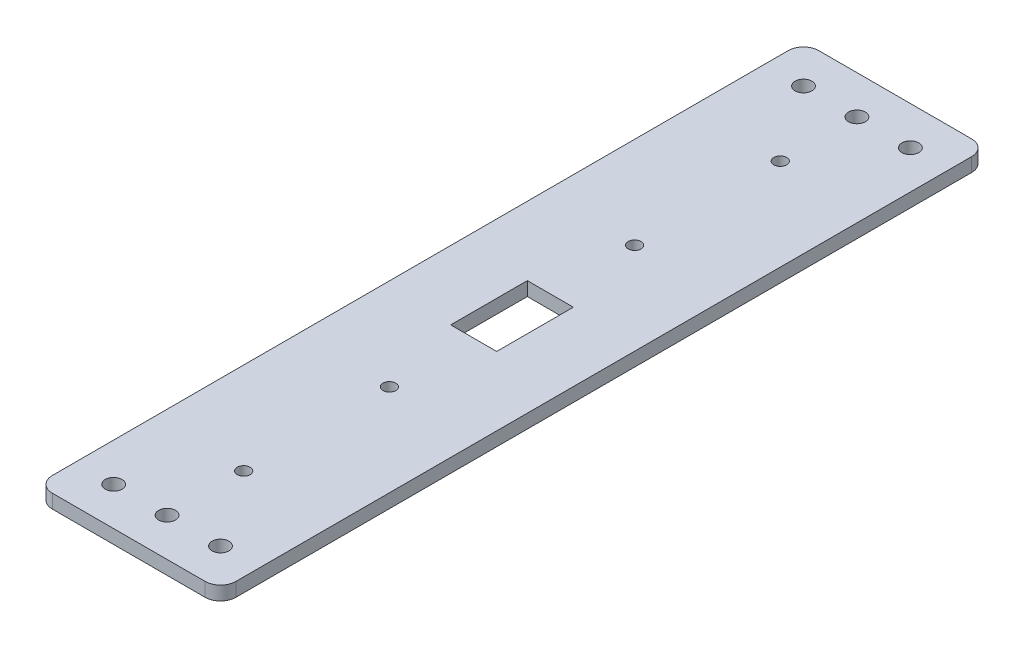
ISO-10303-21;
HEADER;
FILE_DESCRIPTION(('STEP AP214'),'2;1');
FILE_NAME('part.step','',(''),(''),'','','');
FILE_SCHEMA(('AUTOMOTIVE_DESIGN { 1 0 10303 214 1 1 1 1 }'));
ENDSEC;
DATA;
#1=APPLICATION_CONTEXT('core data for automotive mechanical design processes');
#2=APPLICATION_PROTOCOL_DEFINITION('international standard','automotive_design',2000,#1);
#3=PRODUCT_CONTEXT('',#1,'mechanical');
#4=PRODUCT('Part','Part','',(#3));
#5=PRODUCT_RELATED_PRODUCT_CATEGORY('part','',(#4));
#6=PRODUCT_DEFINITION_FORMATION('','',#4);
#7=PRODUCT_DEFINITION_CONTEXT('part definition',#1,'design');
#8=PRODUCT_DEFINITION('design','',#6,#7);
#9=PRODUCT_DEFINITION_SHAPE('','',#8);
#10=(LENGTH_UNIT() NAMED_UNIT(*) SI_UNIT(.MILLI.,.METRE.));
#11=(NAMED_UNIT(*) PLANE_ANGLE_UNIT() SI_UNIT($,.RADIAN.));
#12=(NAMED_UNIT(*) SI_UNIT($,.STERADIAN.) SOLID_ANGLE_UNIT());
#13=UNCERTAINTY_MEASURE_WITH_UNIT(LENGTH_MEASURE(1.E-05),#10,'distance_accuracy_value','');
#14=(GEOMETRIC_REPRESENTATION_CONTEXT(3) GLOBAL_UNCERTAINTY_ASSIGNED_CONTEXT((#13)) GLOBAL_UNIT_ASSIGNED_CONTEXT((#10,
#11,#12)) REPRESENTATION_CONTEXT('',''));
#15=CARTESIAN_POINT('',(0.,0.,0.));
#16=DIRECTION('',(0.,0.,1.));
#17=DIRECTION('',(1.,0.,0.));
#18=AXIS2_PLACEMENT_3D('',#15,#16,#17);
#19=CARTESIAN_POINT('',(-73.,-4.5,-120.));
#20=DIRECTION('',(0.,-1.,0.));
#21=DIRECTION('',(0.,0.,-1.));
#22=AXIS2_PLACEMENT_3D('',#19,#20,#21);
#23=PLANE('',#22);
#24=CARTESIAN_POINT('',(-48.07,-4.5,-40.));
#25=DIRECTION('',(0.,-1.,0.));
#26=DIRECTION('',(0.,0.,-1.));
#27=AXIS2_PLACEMENT_3D('',#24,#25,#26);
#28=CIRCLE('',#27,2.1);
#29=CARTESIAN_POINT('',(-48.07,-4.5,-42.1));
#30=VERTEX_POINT('',#29);
#31=EDGE_CURVE('E197',#30,#30,#28,.T.);
#32=ORIENTED_EDGE('',*,*,#31,.F.);
#33=EDGE_LOOP('',(#32));
#34=FACE_BOUND('',#33,.T.);
#35=CARTESIAN_POINT('',(-30.64,-4.5,112.5));
#36=DIRECTION('',(0.,-1.,0.));
#37=DIRECTION('',(0.,0.,-1.));
#38=AXIS2_PLACEMENT_3D('',#35,#36,#37);
#39=CIRCLE('',#38,2.75);
#40=CARTESIAN_POINT('',(-30.64,-4.5,109.75));
#41=VERTEX_POINT('',#40);
#42=EDGE_CURVE('E213',#41,#41,#39,.T.);
#43=ORIENTED_EDGE('',*,*,#42,.F.);
#44=EDGE_LOOP('',(#43));
#45=FACE_BOUND('',#44,.T.);
#46=CARTESIAN_POINT('',(-65.5,-4.5,-112.5));
#47=DIRECTION('',(0.,-1.,0.));
#48=DIRECTION('',(0.,0.,-1.));
#49=AXIS2_PLACEMENT_3D('',#46,#47,#48);
#50=CIRCLE('',#49,2.75000000000001);
#51=CARTESIAN_POINT('',(-65.5,-4.5,-115.25));
#52=VERTEX_POINT('',#51);
#53=EDGE_CURVE('E225',#52,#52,#50,.T.);
#54=ORIENTED_EDGE('',*,*,#53,.F.);
#55=EDGE_LOOP('',(#54));
#56=FACE_BOUND('',#55,.T.);
#57=CARTESIAN_POINT('',(-48.07,-4.5,87.5));
#58=DIRECTION('',(0.,-1.,0.));
#59=DIRECTION('',(0.,0.,-1.));
#60=AXIS2_PLACEMENT_3D('',#57,#58,#59);
#61=CIRCLE('',#60,2.1);
#62=CARTESIAN_POINT('',(-48.07,-4.5,85.4));
#63=VERTEX_POINT('',#62);
#64=EDGE_CURVE('E237',#63,#63,#61,.T.);
#65=ORIENTED_EDGE('',*,*,#64,.F.);
#66=EDGE_LOOP('',(#65));
#67=FACE_BOUND('',#66,.T.);
#68=CARTESIAN_POINT('',(-48.07,-4.5,-112.5));
#69=DIRECTION('',(0.,-1.,0.));
#70=DIRECTION('',(0.,0.,-1.));
#71=AXIS2_PLACEMENT_3D('',#68,#69,#70);
#72=CIRCLE('',#71,2.75);
#73=CARTESIAN_POINT('',(-48.07,-4.5,-115.25));
#74=VERTEX_POINT('',#73);
#75=EDGE_CURVE('E249',#74,#74,#72,.T.);
#76=ORIENTED_EDGE('',*,*,#75,.F.);
#77=EDGE_LOOP('',(#76));
#78=FACE_BOUND('',#77,.T.);
#79=CARTESIAN_POINT('',(-73.,-4.5,-120.));
#80=DIRECTION('',(0.,-1.,0.));
#81=DIRECTION('',(0.,0.,-1.));
#82=AXIS2_PLACEMENT_3D('',#79,#80,#81);
#83=CIRCLE('',#82,5.);
#84=CARTESIAN_POINT('',(-78.,-4.5,-120.));
#85=VERTEX_POINT('',#84);
#86=CARTESIAN_POINT('',(-73.,-4.5,-125.));
#87=VERTEX_POINT('',#86);
#88=EDGE_CURVE('E255',#85,#87,#83,.T.);
#89=ORIENTED_EDGE('',*,*,#88,.T.);
#90=DIRECTION('',(1.,0.,0.));
#91=VECTOR('',#90,1.);
#92=CARTESIAN_POINT('',(-73.,-4.5,-125.));
#93=LINE('',#92,#91);
#94=CARTESIAN_POINT('',(-23.14,-4.5,-125.));
#95=VERTEX_POINT('',#94);
#96=EDGE_CURVE('E258',#87,#95,#93,.T.);
#97=ORIENTED_EDGE('',*,*,#96,.T.);
#98=CARTESIAN_POINT('',(-23.14,-4.5,-120.));
#99=DIRECTION('',(0.,-1.,0.));
#100=DIRECTION('',(0.,0.,1.));
#101=AXIS2_PLACEMENT_3D('',#98,#99,#100);
#102=CIRCLE('',#101,5.);
#103=CARTESIAN_POINT('',(-18.14,-4.5,-120.));
#104=VERTEX_POINT('',#103);
#105=EDGE_CURVE('E261',#95,#104,#102,.T.);
#106=ORIENTED_EDGE('',*,*,#105,.T.);
#107=DIRECTION('',(0.,0.,1.));
#108=VECTOR('',#107,1.);
#109=CARTESIAN_POINT('',(-18.14,-4.5,120.));
#110=LINE('',#109,#108);
#111=CARTESIAN_POINT('',(-18.14,-4.5,120.));
#112=VERTEX_POINT('',#111);
#113=EDGE_CURVE('E263',#104,#112,#110,.T.);
#114=ORIENTED_EDGE('',*,*,#113,.T.);
#115=CARTESIAN_POINT('',(-23.14,-4.5,120.));
#116=DIRECTION('',(0.,-1.,0.));
#117=DIRECTION('',(0.,0.,-1.));
#118=AXIS2_PLACEMENT_3D('',#115,#116,#117);
#119=CIRCLE('',#118,5.00000000000001);
#120=CARTESIAN_POINT('',(-23.14,-4.5,125.));
#121=VERTEX_POINT('',#120);
#122=EDGE_CURVE('E265',#112,#121,#119,.T.);
#123=ORIENTED_EDGE('',*,*,#122,.T.);
#124=DIRECTION('',(-1.,0.,0.));
#125=VECTOR('',#124,1.);
#126=CARTESIAN_POINT('',(-23.14,-4.5,125.));
#127=LINE('',#126,#125);
#128=CARTESIAN_POINT('',(-73.,-4.5,125.));
#129=VERTEX_POINT('',#128);
#130=EDGE_CURVE('E267',#121,#129,#127,.T.);
#131=ORIENTED_EDGE('',*,*,#130,.T.);
#132=CARTESIAN_POINT('',(-73.,-4.5,120.));
#133=DIRECTION('',(0.,-1.,0.));
#134=DIRECTION('',(0.,0.,-1.));
#135=AXIS2_PLACEMENT_3D('',#132,#133,#134);
#136=CIRCLE('',#135,5.);
#137=CARTESIAN_POINT('',(-78.,-4.5,120.));
#138=VERTEX_POINT('',#137);
#139=EDGE_CURVE('E269',#129,#138,#136,.T.);
#140=ORIENTED_EDGE('',*,*,#139,.T.);
#141=DIRECTION('',(0.,0.,-1.));
#142=VECTOR('',#141,1.);
#143=CARTESIAN_POINT('',(-78.,-4.5,120.));
#144=LINE('',#143,#142);
#145=EDGE_CURVE('E271',#138,#85,#144,.T.);
#146=ORIENTED_EDGE('',*,*,#145,.T.);
#147=EDGE_LOOP('',(#89,#97,#106,#114,#123,#131,#140,#146));
#148=FACE_BOUND('',#147,.T.);
#149=CARTESIAN_POINT('',(-48.07,-4.5,-87.5));
#150=DIRECTION('',(0.,-1.,0.));
#151=DIRECTION('',(0.,0.,-1.));
#152=AXIS2_PLACEMENT_3D('',#149,#150,#151);
#153=CIRCLE('',#152,2.1);
#154=CARTESIAN_POINT('',(-48.07,-4.5,-89.6));
#155=VERTEX_POINT('',#154);
#156=EDGE_CURVE('E243',#155,#155,#153,.T.);
#157=ORIENTED_EDGE('',*,*,#156,.F.);
#158=EDGE_LOOP('',(#157));
#159=FACE_BOUND('',#158,.T.);
#160=CARTESIAN_POINT('',(-48.07,-4.5,112.5));
#161=DIRECTION('',(0.,-1.,0.));
#162=DIRECTION('',(0.,0.,-1.));
#163=AXIS2_PLACEMENT_3D('',#160,#161,#162);
#164=CIRCLE('',#163,2.75);
#165=CARTESIAN_POINT('',(-48.07,-4.5,109.75));
#166=VERTEX_POINT('',#165);
#167=EDGE_CURVE('E231',#166,#166,#164,.T.);
#168=ORIENTED_EDGE('',*,*,#167,.F.);
#169=EDGE_LOOP('',(#168));
#170=FACE_BOUND('',#169,.T.);
#171=CARTESIAN_POINT('',(-30.64,-4.5,-112.5));
#172=DIRECTION('',(0.,-1.,0.));
#173=DIRECTION('',(0.,0.,-1.));
#174=AXIS2_PLACEMENT_3D('',#171,#172,#173);
#175=CIRCLE('',#174,2.75);
#176=CARTESIAN_POINT('',(-30.64,-4.5,-115.25));
#177=VERTEX_POINT('',#176);
#178=EDGE_CURVE('E219',#177,#177,#175,.T.);
#179=ORIENTED_EDGE('',*,*,#178,.F.);
#180=EDGE_LOOP('',(#179));
#181=FACE_BOUND('',#180,.T.);
#182=CARTESIAN_POINT('',(-65.5,-4.5,112.5));
#183=DIRECTION('',(0.,-1.,0.));
#184=DIRECTION('',(0.,0.,-1.));
#185=AXIS2_PLACEMENT_3D('',#182,#183,#184);
#186=CIRCLE('',#185,2.75000000000001);
#187=CARTESIAN_POINT('',(-65.5,-4.5,109.75));
#188=VERTEX_POINT('',#187);
#189=EDGE_CURVE('E207',#188,#188,#186,.T.);
#190=ORIENTED_EDGE('',*,*,#189,.F.);
#191=EDGE_LOOP('',(#190));
#192=FACE_BOUND('',#191,.T.);
#193=DIRECTION('',(1.,0.,0.));
#194=VECTOR('',#193,1.);
#195=CARTESIAN_POINT('',(-55.57,-4.5,-12.5));
#196=LINE('',#195,#194);
#197=CARTESIAN_POINT('',(-55.57,-4.5,-12.5));
#198=VERTEX_POINT('',#197);
#199=CARTESIAN_POINT('',(-40.57,-4.5,-12.5));
#200=VERTEX_POINT('',#199);
#201=EDGE_CURVE('E176',#198,#200,#196,.T.);
#202=ORIENTED_EDGE('',*,*,#201,.F.);
#203=DIRECTION('',(0.,0.,-1.));
#204=VECTOR('',#203,1.);
#205=CARTESIAN_POINT('',(-55.57,-4.5,12.5));
#206=LINE('',#205,#204);
#207=CARTESIAN_POINT('',(-55.57,-4.5,12.5));
#208=VERTEX_POINT('',#207);
#209=EDGE_CURVE('E168',#208,#198,#206,.T.);
#210=ORIENTED_EDGE('',*,*,#209,.F.);
#211=DIRECTION('',(-1.,0.,0.));
#212=VECTOR('',#211,1.);
#213=CARTESIAN_POINT('',(-55.57,-4.5,12.5));
#214=LINE('',#213,#212);
#215=CARTESIAN_POINT('',(-40.57,-4.5,12.5));
#216=VERTEX_POINT('',#215);
#217=EDGE_CURVE('E191',#216,#208,#214,.T.);
#218=ORIENTED_EDGE('',*,*,#217,.F.);
#219=DIRECTION('',(0.,0.,1.));
#220=VECTOR('',#219,1.);
#221=CARTESIAN_POINT('',(-40.57,-4.5,12.5));
#222=LINE('',#221,#220);
#223=EDGE_CURVE('E189',#200,#216,#222,.T.);
#224=ORIENTED_EDGE('',*,*,#223,.F.);
#225=EDGE_LOOP('',(#202,#210,#218,#224));
#226=FACE_BOUND('',#225,.T.);
#227=CARTESIAN_POINT('',(-48.07,-4.5,40.));
#228=DIRECTION('',(0.,-1.,0.));
#229=DIRECTION('',(0.,0.,-1.));
#230=AXIS2_PLACEMENT_3D('',#227,#228,#229);
#231=CIRCLE('',#230,2.1);
#232=CARTESIAN_POINT('',(-48.07,-4.5,37.9));
#233=VERTEX_POINT('',#232);
#234=EDGE_CURVE('E438',#233,#233,#231,.T.);
#235=ORIENTED_EDGE('',*,*,#234,.F.);
#236=EDGE_LOOP('',(#235));
#237=FACE_BOUND('',#236,.T.);
#238=ADVANCED_FACE('F79',(#34,#45,#56,#67,#78,#148,#159,#170,#181,#192,#226,#237),#23,.T.);
#239=CARTESIAN_POINT('',(-73.,0.,-120.));
#240=DIRECTION('',(0.,-1.,0.));
#241=DIRECTION('',(0.,0.,-1.));
#242=AXIS2_PLACEMENT_3D('',#239,#240,#241);
#243=PLANE('',#242);
#244=CARTESIAN_POINT('',(-65.5,0.,112.5));
#245=DIRECTION('',(0.,-1.,0.));
#246=DIRECTION('',(0.,0.,-1.));
#247=AXIS2_PLACEMENT_3D('',#244,#245,#246);
#248=CIRCLE('',#247,2.75000000000001);
#249=CARTESIAN_POINT('',(-65.5,0.,109.75));
#250=VERTEX_POINT('',#249);
#251=EDGE_CURVE('E184',#250,#250,#248,.T.);
#252=ORIENTED_EDGE('',*,*,#251,.T.);
#253=EDGE_LOOP('',(#252));
#254=FACE_BOUND('',#253,.T.);
#255=CARTESIAN_POINT('',(-30.64,0.,112.5));
#256=DIRECTION('',(0.,-1.,0.));
#257=DIRECTION('',(0.,0.,-1.));
#258=AXIS2_PLACEMENT_3D('',#255,#256,#257);
#259=CIRCLE('',#258,2.75);
#260=CARTESIAN_POINT('',(-30.64,0.,109.75));
#261=VERTEX_POINT('',#260);
#262=EDGE_CURVE('E210',#261,#261,#259,.T.);
#263=ORIENTED_EDGE('',*,*,#262,.T.);
#264=EDGE_LOOP('',(#263));
#265=FACE_BOUND('',#264,.T.);
#266=CARTESIAN_POINT('',(-30.64,0.,-112.5));
#267=DIRECTION('',(0.,-1.,0.));
#268=DIRECTION('',(0.,0.,-1.));
#269=AXIS2_PLACEMENT_3D('',#266,#267,#268);
#270=CIRCLE('',#269,2.75);
#271=CARTESIAN_POINT('',(-30.64,0.,-115.25));
#272=VERTEX_POINT('',#271);
#273=EDGE_CURVE('E216',#272,#272,#270,.T.);
#274=ORIENTED_EDGE('',*,*,#273,.T.);
#275=EDGE_LOOP('',(#274));
#276=FACE_BOUND('',#275,.T.);
#277=CARTESIAN_POINT('',(-65.5,0.,-112.5));
#278=DIRECTION('',(0.,-1.,0.));
#279=DIRECTION('',(0.,0.,-1.));
#280=AXIS2_PLACEMENT_3D('',#277,#278,#279);
#281=CIRCLE('',#280,2.75000000000001);
#282=CARTESIAN_POINT('',(-65.5,0.,-115.25));
#283=VERTEX_POINT('',#282);
#284=EDGE_CURVE('E222',#283,#283,#281,.T.);
#285=ORIENTED_EDGE('',*,*,#284,.T.);
#286=EDGE_LOOP('',(#285));
#287=FACE_BOUND('',#286,.T.);
#288=CARTESIAN_POINT('',(-48.07,0.,112.5));
#289=DIRECTION('',(0.,-1.,0.));
#290=DIRECTION('',(0.,0.,-1.));
#291=AXIS2_PLACEMENT_3D('',#288,#289,#290);
#292=CIRCLE('',#291,2.75);
#293=CARTESIAN_POINT('',(-48.07,0.,109.75));
#294=VERTEX_POINT('',#293);
#295=EDGE_CURVE('E228',#294,#294,#292,.T.);
#296=ORIENTED_EDGE('',*,*,#295,.T.);
#297=EDGE_LOOP('',(#296));
#298=FACE_BOUND('',#297,.T.);
#299=CARTESIAN_POINT('',(-48.07,0.,87.5));
#300=DIRECTION('',(0.,-1.,0.));
#301=DIRECTION('',(0.,0.,-1.));
#302=AXIS2_PLACEMENT_3D('',#299,#300,#301);
#303=CIRCLE('',#302,2.1);
#304=CARTESIAN_POINT('',(-48.07,0.,85.4));
#305=VERTEX_POINT('',#304);
#306=EDGE_CURVE('E234',#305,#305,#303,.T.);
#307=ORIENTED_EDGE('',*,*,#306,.T.);
#308=EDGE_LOOP('',(#307));
#309=FACE_BOUND('',#308,.T.);
#310=CARTESIAN_POINT('',(-48.07,0.,-87.5));
#311=DIRECTION('',(0.,-1.,0.));
#312=DIRECTION('',(0.,0.,-1.));
#313=AXIS2_PLACEMENT_3D('',#310,#311,#312);
#314=CIRCLE('',#313,2.1);
#315=CARTESIAN_POINT('',(-48.07,0.,-89.6));
#316=VERTEX_POINT('',#315);
#317=EDGE_CURVE('E240',#316,#316,#314,.T.);
#318=ORIENTED_EDGE('',*,*,#317,.T.);
#319=EDGE_LOOP('',(#318));
#320=FACE_BOUND('',#319,.T.);
#321=CARTESIAN_POINT('',(-48.07,0.,-112.5));
#322=DIRECTION('',(0.,-1.,0.));
#323=DIRECTION('',(0.,0.,-1.));
#324=AXIS2_PLACEMENT_3D('',#321,#322,#323);
#325=CIRCLE('',#324,2.75);
#326=CARTESIAN_POINT('',(-48.07,0.,-115.25));
#327=VERTEX_POINT('',#326);
#328=EDGE_CURVE('E246',#327,#327,#325,.T.);
#329=ORIENTED_EDGE('',*,*,#328,.T.);
#330=EDGE_LOOP('',(#329));
#331=FACE_BOUND('',#330,.T.);
#332=CARTESIAN_POINT('',(-73.,0.,-120.));
#333=DIRECTION('',(0.,-1.,0.));
#334=DIRECTION('',(0.,0.,-1.));
#335=AXIS2_PLACEMENT_3D('',#332,#333,#334);
#336=CIRCLE('',#335,5.);
#337=CARTESIAN_POINT('',(-78.,0.,-120.));
#338=VERTEX_POINT('',#337);
#339=CARTESIAN_POINT('',(-73.,0.,-125.));
#340=VERTEX_POINT('',#339);
#341=EDGE_CURVE('E252',#338,#340,#336,.T.);
#342=ORIENTED_EDGE('',*,*,#341,.F.);
#343=DIRECTION('',(0.,0.,-1.));
#344=VECTOR('',#343,1.);
#345=CARTESIAN_POINT('',(-78.,0.,120.));
#346=LINE('',#345,#344);
#347=CARTESIAN_POINT('',(-78.,0.,120.));
#348=VERTEX_POINT('',#347);
#349=EDGE_CURVE('E259',#348,#338,#346,.T.);
#350=ORIENTED_EDGE('',*,*,#349,.F.);
#351=CARTESIAN_POINT('',(-73.,0.,120.));
#352=DIRECTION('',(0.,-1.,0.));
#353=DIRECTION('',(0.,0.,-1.));
#354=AXIS2_PLACEMENT_3D('',#351,#352,#353);
#355=CIRCLE('',#354,5.);
#356=CARTESIAN_POINT('',(-73.,0.,125.));
#357=VERTEX_POINT('',#356);
#358=EDGE_CURVE('E286',#357,#348,#355,.T.);
#359=ORIENTED_EDGE('',*,*,#358,.F.);
#360=DIRECTION('',(-1.,0.,0.));
#361=VECTOR('',#360,1.);
#362=CARTESIAN_POINT('',(-23.14,0.,125.));
#363=LINE('',#362,#361);
#364=CARTESIAN_POINT('',(-23.14,0.,125.));
#365=VERTEX_POINT('',#364);
#366=EDGE_CURVE('E284',#365,#357,#363,.T.);
#367=ORIENTED_EDGE('',*,*,#366,.F.);
#368=CARTESIAN_POINT('',(-23.14,0.,120.));
#369=DIRECTION('',(0.,-1.,0.));
#370=DIRECTION('',(0.,0.,-1.));
#371=AXIS2_PLACEMENT_3D('',#368,#369,#370);
#372=CIRCLE('',#371,5.00000000000001);
#373=CARTESIAN_POINT('',(-18.14,0.,120.));
#374=VERTEX_POINT('',#373);
#375=EDGE_CURVE('E282',#374,#365,#372,.T.);
#376=ORIENTED_EDGE('',*,*,#375,.F.);
#377=DIRECTION('',(0.,0.,1.));
#378=VECTOR('',#377,1.);
#379=CARTESIAN_POINT('',(-18.14,0.,120.));
#380=LINE('',#379,#378);
#381=CARTESIAN_POINT('',(-18.14,0.,-120.));
#382=VERTEX_POINT('',#381);
#383=EDGE_CURVE('E280',#382,#374,#380,.T.);
#384=ORIENTED_EDGE('',*,*,#383,.F.);
#385=CARTESIAN_POINT('',(-23.14,0.,-120.));
#386=DIRECTION('',(0.,-1.,0.));
#387=DIRECTION('',(0.,0.,1.));
#388=AXIS2_PLACEMENT_3D('',#385,#386,#387);
#389=CIRCLE('',#388,5.);
#390=CARTESIAN_POINT('',(-23.14,0.,-125.));
#391=VERTEX_POINT('',#390);
#392=EDGE_CURVE('E278',#391,#382,#389,.T.);
#393=ORIENTED_EDGE('',*,*,#392,.F.);
#394=DIRECTION('',(1.,0.,0.));
#395=VECTOR('',#394,1.);
#396=CARTESIAN_POINT('',(-73.,0.,-125.));
#397=LINE('',#396,#395);
#398=EDGE_CURVE('E276',#340,#391,#397,.T.);
#399=ORIENTED_EDGE('',*,*,#398,.F.);
#400=EDGE_LOOP('',(#342,#350,#359,#367,#376,#384,#393,#399));
#401=FACE_BOUND('',#400,.T.);
#402=DIRECTION('',(0.,0.,-1.));
#403=VECTOR('',#402,1.);
#404=CARTESIAN_POINT('',(-55.57,0.,12.5));
#405=LINE('',#404,#403);
#406=CARTESIAN_POINT('',(-55.57,0.,12.5));
#407=VERTEX_POINT('',#406);
#408=CARTESIAN_POINT('',(-55.57,0.,-12.5));
#409=VERTEX_POINT('',#408);
#410=EDGE_CURVE('E102',#407,#409,#405,.T.);
#411=ORIENTED_EDGE('',*,*,#410,.T.);
#412=DIRECTION('',(1.,0.,0.));
#413=VECTOR('',#412,1.);
#414=CARTESIAN_POINT('',(-55.57,0.,-12.5));
#415=LINE('',#414,#413);
#416=CARTESIAN_POINT('',(-40.57,0.,-12.5));
#417=VERTEX_POINT('',#416);
#418=EDGE_CURVE('E183',#409,#417,#415,.T.);
#419=ORIENTED_EDGE('',*,*,#418,.T.);
#420=DIRECTION('',(0.,0.,1.));
#421=VECTOR('',#420,1.);
#422=CARTESIAN_POINT('',(-40.57,0.,12.5));
#423=LINE('',#422,#421);
#424=CARTESIAN_POINT('',(-40.57,0.,12.5));
#425=VERTEX_POINT('',#424);
#426=EDGE_CURVE('E199',#417,#425,#423,.T.);
#427=ORIENTED_EDGE('',*,*,#426,.T.);
#428=DIRECTION('',(-1.,0.,0.));
#429=VECTOR('',#428,1.);
#430=CARTESIAN_POINT('',(-55.57,0.,12.5));
#431=LINE('',#430,#429);
#432=EDGE_CURVE('E177',#425,#407,#431,.T.);
#433=ORIENTED_EDGE('',*,*,#432,.T.);
#434=EDGE_LOOP('',(#411,#419,#427,#433));
#435=FACE_BOUND('',#434,.T.);
#436=CARTESIAN_POINT('',(-48.07,0.,-40.));
#437=DIRECTION('',(0.,-1.,0.));
#438=DIRECTION('',(0.,0.,-1.));
#439=AXIS2_PLACEMENT_3D('',#436,#437,#438);
#440=CIRCLE('',#439,2.1);
#441=CARTESIAN_POINT('',(-48.07,0.,-42.1));
#442=VERTEX_POINT('',#441);
#443=EDGE_CURVE('E444',#442,#442,#440,.T.);
#444=ORIENTED_EDGE('',*,*,#443,.T.);
#445=EDGE_LOOP('',(#444));
#446=FACE_BOUND('',#445,.T.);
#447=CARTESIAN_POINT('',(-48.07,0.,40.));
#448=DIRECTION('',(0.,-1.,0.));
#449=DIRECTION('',(0.,0.,-1.));
#450=AXIS2_PLACEMENT_3D('',#447,#448,#449);
#451=CIRCLE('',#450,2.1);
#452=CARTESIAN_POINT('',(-48.07,0.,37.9));
#453=VERTEX_POINT('',#452);
#454=EDGE_CURVE('E441',#453,#453,#451,.T.);
#455=ORIENTED_EDGE('',*,*,#454,.T.);
#456=EDGE_LOOP('',(#455));
#457=FACE_BOUND('',#456,.T.);
#458=ADVANCED_FACE('F316',(#254,#265,#276,#287,#298,#309,#320,#331,#401,#435,#446,#457),#243,.F.);
#459=CARTESIAN_POINT('',(-73.,-4.5,-120.));
#460=DIRECTION('',(0.,1.,0.));
#461=DIRECTION('',(0.,0.,1.));
#462=AXIS2_PLACEMENT_3D('',#459,#460,#461);
#463=CYLINDRICAL_SURFACE('',#462,5.);
#464=ORIENTED_EDGE('',*,*,#341,.T.);
#465=DIRECTION('',(0.,1.,0.));
#466=VECTOR('',#465,1.);
#467=CARTESIAN_POINT('',(-73.,-4.5,-125.));
#468=LINE('',#467,#466);
#469=EDGE_CURVE('E12',#87,#340,#468,.T.);
#470=ORIENTED_EDGE('',*,*,#469,.F.);
#471=ORIENTED_EDGE('',*,*,#88,.F.);
#472=DIRECTION('',(0.,1.,0.));
#473=VECTOR('',#472,1.);
#474=CARTESIAN_POINT('',(-78.,-4.5,-120.));
#475=LINE('',#474,#473);
#476=EDGE_CURVE('E273',#85,#338,#475,.T.);
#477=ORIENTED_EDGE('',*,*,#476,.T.);
#478=EDGE_LOOP('',(#464,#470,#471,#477));
#479=FACE_BOUND('',#478,.T.);
#480=ADVANCED_FACE('F81',(#479),#463,.T.);
#481=CARTESIAN_POINT('',(-73.,-4.5,-125.));
#482=DIRECTION('',(0.,0.,1.));
#483=DIRECTION('',(1.,0.,0.));
#484=AXIS2_PLACEMENT_3D('',#481,#482,#483);
#485=PLANE('',#484);
#486=ORIENTED_EDGE('',*,*,#398,.T.);
#487=DIRECTION('',(0.,1.,0.));
#488=VECTOR('',#487,1.);
#489=CARTESIAN_POINT('',(-23.14,-4.5,-125.));
#490=LINE('',#489,#488);
#491=EDGE_CURVE('E87',#95,#391,#490,.T.);
#492=ORIENTED_EDGE('',*,*,#491,.F.);
#493=ORIENTED_EDGE('',*,*,#96,.F.);
#494=ORIENTED_EDGE('',*,*,#469,.T.);
#495=EDGE_LOOP('',(#486,#492,#493,#494));
#496=FACE_BOUND('',#495,.T.);
#497=ADVANCED_FACE('F334',(#496),#485,.F.);
#498=CARTESIAN_POINT('',(-23.14,-4.5,-120.));
#499=DIRECTION('',(0.,1.,0.));
#500=DIRECTION('',(0.,0.,1.));
#501=AXIS2_PLACEMENT_3D('',#498,#499,#500);
#502=CYLINDRICAL_SURFACE('',#501,5.);
#503=ORIENTED_EDGE('',*,*,#392,.T.);
#504=DIRECTION('',(0.,1.,0.));
#505=VECTOR('',#504,1.);
#506=CARTESIAN_POINT('',(-18.14,-4.5,-120.));
#507=LINE('',#506,#505);
#508=EDGE_CURVE('E303',#104,#382,#507,.T.);
#509=ORIENTED_EDGE('',*,*,#508,.F.);
#510=ORIENTED_EDGE('',*,*,#105,.F.);
#511=ORIENTED_EDGE('',*,*,#491,.T.);
#512=EDGE_LOOP('',(#503,#509,#510,#511));
#513=FACE_BOUND('',#512,.T.);
#514=ADVANCED_FACE('F310',(#513),#502,.T.);
#515=CARTESIAN_POINT('',(-18.14,-4.5,120.));
#516=DIRECTION('',(-1.,0.,0.));
#517=DIRECTION('',(0.,0.,1.));
#518=AXIS2_PLACEMENT_3D('',#515,#516,#517);
#519=PLANE('',#518);
#520=ORIENTED_EDGE('',*,*,#383,.T.);
#521=DIRECTION('',(0.,1.,0.));
#522=VECTOR('',#521,1.);
#523=CARTESIAN_POINT('',(-18.14,-4.5,120.));
#524=LINE('',#523,#522);
#525=EDGE_CURVE('E300',#112,#374,#524,.T.);
#526=ORIENTED_EDGE('',*,*,#525,.F.);
#527=ORIENTED_EDGE('',*,*,#113,.F.);
#528=ORIENTED_EDGE('',*,*,#508,.T.);
#529=EDGE_LOOP('',(#520,#526,#527,#528));
#530=FACE_BOUND('',#529,.T.);
#531=ADVANCED_FACE('F322',(#530),#519,.F.);
#532=CARTESIAN_POINT('',(-23.14,-4.5,120.));
#533=DIRECTION('',(0.,1.,0.));
#534=DIRECTION('',(0.,0.,1.));
#535=AXIS2_PLACEMENT_3D('',#532,#533,#534);
#536=CYLINDRICAL_SURFACE('',#535,5.00000000000001);
#537=ORIENTED_EDGE('',*,*,#375,.T.);
#538=DIRECTION('',(0.,1.,0.));
#539=VECTOR('',#538,1.);
#540=CARTESIAN_POINT('',(-23.14,-4.5,125.));
#541=LINE('',#540,#539);
#542=EDGE_CURVE('E297',#121,#365,#541,.T.);
#543=ORIENTED_EDGE('',*,*,#542,.F.);
#544=ORIENTED_EDGE('',*,*,#122,.F.);
#545=ORIENTED_EDGE('',*,*,#525,.T.);
#546=EDGE_LOOP('',(#537,#543,#544,#545));
#547=FACE_BOUND('',#546,.T.);
#548=ADVANCED_FACE('F326',(#547),#536,.T.);
#549=CARTESIAN_POINT('',(-23.14,-4.5,125.));
#550=DIRECTION('',(0.,0.,-1.));
#551=DIRECTION('',(-1.,0.,0.));
#552=AXIS2_PLACEMENT_3D('',#549,#550,#551);
#553=PLANE('',#552);
#554=ORIENTED_EDGE('',*,*,#366,.T.);
#555=DIRECTION('',(0.,1.,0.));
#556=VECTOR('',#555,1.);
#557=CARTESIAN_POINT('',(-73.,-4.5,125.));
#558=LINE('',#557,#556);
#559=EDGE_CURVE('E294',#129,#357,#558,.T.);
#560=ORIENTED_EDGE('',*,*,#559,.F.);
#561=ORIENTED_EDGE('',*,*,#130,.F.);
#562=ORIENTED_EDGE('',*,*,#542,.T.);
#563=EDGE_LOOP('',(#554,#560,#561,#562));
#564=FACE_BOUND('',#563,.T.);
#565=ADVANCED_FACE('F347',(#564),#553,.F.);
#566=CARTESIAN_POINT('',(-73.,-4.5,120.));
#567=DIRECTION('',(0.,1.,0.));
#568=DIRECTION('',(0.,0.,1.));
#569=AXIS2_PLACEMENT_3D('',#566,#567,#568);
#570=CYLINDRICAL_SURFACE('',#569,5.);
#571=ORIENTED_EDGE('',*,*,#358,.T.);
#572=DIRECTION('',(0.,1.,0.));
#573=VECTOR('',#572,1.);
#574=CARTESIAN_POINT('',(-78.,-4.5,120.));
#575=LINE('',#574,#573);
#576=EDGE_CURVE('E291',#138,#348,#575,.T.);
#577=ORIENTED_EDGE('',*,*,#576,.F.);
#578=ORIENTED_EDGE('',*,*,#139,.F.);
#579=ORIENTED_EDGE('',*,*,#559,.T.);
#580=EDGE_LOOP('',(#571,#577,#578,#579));
#581=FACE_BOUND('',#580,.T.);
#582=ADVANCED_FACE('F345',(#581),#570,.T.);
#583=CARTESIAN_POINT('',(-78.,-4.5,120.));
#584=DIRECTION('',(1.,0.,0.));
#585=DIRECTION('',(0.,0.,-1.));
#586=AXIS2_PLACEMENT_3D('',#583,#584,#585);
#587=PLANE('',#586);
#588=ORIENTED_EDGE('',*,*,#349,.T.);
#589=ORIENTED_EDGE('',*,*,#476,.F.);
#590=ORIENTED_EDGE('',*,*,#145,.F.);
#591=ORIENTED_EDGE('',*,*,#576,.T.);
#592=EDGE_LOOP('',(#588,#589,#590,#591));
#593=FACE_BOUND('',#592,.T.);
#594=ADVANCED_FACE('F340',(#593),#587,.F.);
#595=CARTESIAN_POINT('',(-48.07,-4.5,-112.5));
#596=DIRECTION('',(0.,1.,0.));
#597=DIRECTION('',(0.,0.,1.));
#598=AXIS2_PLACEMENT_3D('',#595,#596,#597);
#599=CYLINDRICAL_SURFACE('',#598,2.75);
#600=ORIENTED_EDGE('',*,*,#75,.T.);
#601=EDGE_LOOP('',(#600));
#602=FACE_BOUND('',#601,.T.);
#603=ORIENTED_EDGE('',*,*,#328,.F.);
#604=EDGE_LOOP('',(#603));
#605=FACE_BOUND('',#604,.T.);
#606=ADVANCED_FACE('F368',(#602,#605),#599,.F.);
#607=CARTESIAN_POINT('',(-48.07,-4.5,-87.5));
#608=DIRECTION('',(0.,1.,0.));
#609=DIRECTION('',(0.,0.,1.));
#610=AXIS2_PLACEMENT_3D('',#607,#608,#609);
#611=CYLINDRICAL_SURFACE('',#610,2.1);
#612=ORIENTED_EDGE('',*,*,#156,.T.);
#613=EDGE_LOOP('',(#612));
#614=FACE_BOUND('',#613,.T.);
#615=ORIENTED_EDGE('',*,*,#317,.F.);
#616=EDGE_LOOP('',(#615));
#617=FACE_BOUND('',#616,.T.);
#618=ADVANCED_FACE('F375',(#614,#617),#611,.F.);
#619=CARTESIAN_POINT('',(-48.07,-4.5,87.5));
#620=DIRECTION('',(0.,1.,0.));
#621=DIRECTION('',(0.,0.,1.));
#622=AXIS2_PLACEMENT_3D('',#619,#620,#621);
#623=CYLINDRICAL_SURFACE('',#622,2.1);
#624=ORIENTED_EDGE('',*,*,#64,.T.);
#625=EDGE_LOOP('',(#624));
#626=FACE_BOUND('',#625,.T.);
#627=ORIENTED_EDGE('',*,*,#306,.F.);
#628=EDGE_LOOP('',(#627));
#629=FACE_BOUND('',#628,.T.);
#630=ADVANCED_FACE('F381',(#626,#629),#623,.F.);
#631=CARTESIAN_POINT('',(-48.07,-4.5,112.5));
#632=DIRECTION('',(0.,1.,0.));
#633=DIRECTION('',(0.,0.,1.));
#634=AXIS2_PLACEMENT_3D('',#631,#632,#633);
#635=CYLINDRICAL_SURFACE('',#634,2.75);
#636=ORIENTED_EDGE('',*,*,#167,.T.);
#637=EDGE_LOOP('',(#636));
#638=FACE_BOUND('',#637,.T.);
#639=ORIENTED_EDGE('',*,*,#295,.F.);
#640=EDGE_LOOP('',(#639));
#641=FACE_BOUND('',#640,.T.);
#642=ADVANCED_FACE('F391',(#638,#641),#635,.F.);
#643=CARTESIAN_POINT('',(-65.5,-4.5,-112.5));
#644=DIRECTION('',(0.,1.,0.));
#645=DIRECTION('',(0.,0.,1.));
#646=AXIS2_PLACEMENT_3D('',#643,#644,#645);
#647=CYLINDRICAL_SURFACE('',#646,2.75000000000001);
#648=ORIENTED_EDGE('',*,*,#53,.T.);
#649=EDGE_LOOP('',(#648));
#650=FACE_BOUND('',#649,.T.);
#651=ORIENTED_EDGE('',*,*,#284,.F.);
#652=EDGE_LOOP('',(#651));
#653=FACE_BOUND('',#652,.T.);
#654=ADVANCED_FACE('F398',(#650,#653),#647,.F.);
#655=CARTESIAN_POINT('',(-30.64,-4.5,-112.5));
#656=DIRECTION('',(0.,1.,0.));
#657=DIRECTION('',(0.,0.,1.));
#658=AXIS2_PLACEMENT_3D('',#655,#656,#657);
#659=CYLINDRICAL_SURFACE('',#658,2.75);
#660=ORIENTED_EDGE('',*,*,#178,.T.);
#661=EDGE_LOOP('',(#660));
#662=FACE_BOUND('',#661,.T.);
#663=ORIENTED_EDGE('',*,*,#273,.F.);
#664=EDGE_LOOP('',(#663));
#665=FACE_BOUND('',#664,.T.);
#666=ADVANCED_FACE('F402',(#662,#665),#659,.F.);
#667=CARTESIAN_POINT('',(-30.64,-4.5,112.5));
#668=DIRECTION('',(0.,1.,0.));
#669=DIRECTION('',(0.,0.,1.));
#670=AXIS2_PLACEMENT_3D('',#667,#668,#669);
#671=CYLINDRICAL_SURFACE('',#670,2.75);
#672=ORIENTED_EDGE('',*,*,#42,.T.);
#673=EDGE_LOOP('',(#672));
#674=FACE_BOUND('',#673,.T.);
#675=ORIENTED_EDGE('',*,*,#262,.F.);
#676=EDGE_LOOP('',(#675));
#677=FACE_BOUND('',#676,.T.);
#678=ADVANCED_FACE('F406',(#674,#677),#671,.F.);
#679=CARTESIAN_POINT('',(-65.5,-4.5,112.5));
#680=DIRECTION('',(0.,1.,0.));
#681=DIRECTION('',(0.,0.,1.));
#682=AXIS2_PLACEMENT_3D('',#679,#680,#681);
#683=CYLINDRICAL_SURFACE('',#682,2.75000000000001);
#684=ORIENTED_EDGE('',*,*,#189,.T.);
#685=EDGE_LOOP('',(#684));
#686=FACE_BOUND('',#685,.T.);
#687=ORIENTED_EDGE('',*,*,#251,.F.);
#688=EDGE_LOOP('',(#687));
#689=FACE_BOUND('',#688,.T.);
#690=ADVANCED_FACE('F410',(#686,#689),#683,.F.);
#691=CARTESIAN_POINT('',(-55.57,-4.5,12.5));
#692=DIRECTION('',(1.,0.,0.));
#693=DIRECTION('',(0.,0.,-1.));
#694=AXIS2_PLACEMENT_3D('',#691,#692,#693);
#695=PLANE('',#694);
#696=ORIENTED_EDGE('',*,*,#410,.F.);
#697=DIRECTION('',(0.,1.,0.));
#698=VECTOR('',#697,1.);
#699=CARTESIAN_POINT('',(-55.57,-4.5,12.5));
#700=LINE('',#699,#698);
#701=EDGE_CURVE('E172',#208,#407,#700,.T.);
#702=ORIENTED_EDGE('',*,*,#701,.F.);
#703=ORIENTED_EDGE('',*,*,#209,.T.);
#704=DIRECTION('',(0.,1.,0.));
#705=VECTOR('',#704,1.);
#706=CARTESIAN_POINT('',(-55.57,-4.5,-12.5));
#707=LINE('',#706,#705);
#708=EDGE_CURVE('E171',#198,#409,#707,.T.);
#709=ORIENTED_EDGE('',*,*,#708,.T.);
#710=EDGE_LOOP('',(#696,#702,#703,#709));
#711=FACE_BOUND('',#710,.T.);
#712=ADVANCED_FACE('F170',(#711),#695,.T.);
#713=CARTESIAN_POINT('',(-55.57,-4.5,-12.5));
#714=DIRECTION('',(0.,0.,1.));
#715=DIRECTION('',(1.,0.,0.));
#716=AXIS2_PLACEMENT_3D('',#713,#714,#715);
#717=PLANE('',#716);
#718=ORIENTED_EDGE('',*,*,#418,.F.);
#719=ORIENTED_EDGE('',*,*,#708,.F.);
#720=ORIENTED_EDGE('',*,*,#201,.T.);
#721=DIRECTION('',(0.,1.,0.));
#722=VECTOR('',#721,1.);
#723=CARTESIAN_POINT('',(-40.57,-4.5,-12.5));
#724=LINE('',#723,#722);
#725=EDGE_CURVE('E185',#200,#417,#724,.T.);
#726=ORIENTED_EDGE('',*,*,#725,.T.);
#727=EDGE_LOOP('',(#718,#719,#720,#726));
#728=FACE_BOUND('',#727,.T.);
#729=ADVANCED_FACE('F180',(#728),#717,.T.);
#730=CARTESIAN_POINT('',(-40.57,-4.5,12.5));
#731=DIRECTION('',(-1.,0.,0.));
#732=DIRECTION('',(0.,0.,1.));
#733=AXIS2_PLACEMENT_3D('',#730,#731,#732);
#734=PLANE('',#733);
#735=ORIENTED_EDGE('',*,*,#426,.F.);
#736=ORIENTED_EDGE('',*,*,#725,.F.);
#737=ORIENTED_EDGE('',*,*,#223,.T.);
#738=DIRECTION('',(0.,1.,0.));
#739=VECTOR('',#738,1.);
#740=CARTESIAN_POINT('',(-40.57,-4.5,12.5));
#741=LINE('',#740,#739);
#742=EDGE_CURVE('E94',#216,#425,#741,.T.);
#743=ORIENTED_EDGE('',*,*,#742,.T.);
#744=EDGE_LOOP('',(#735,#736,#737,#743));
#745=FACE_BOUND('',#744,.T.);
#746=ADVANCED_FACE('F419',(#745),#734,.T.);
#747=CARTESIAN_POINT('',(-55.57,-4.5,12.5));
#748=DIRECTION('',(0.,0.,-1.));
#749=DIRECTION('',(-1.,0.,0.));
#750=AXIS2_PLACEMENT_3D('',#747,#748,#749);
#751=PLANE('',#750);
#752=ORIENTED_EDGE('',*,*,#432,.F.);
#753=ORIENTED_EDGE('',*,*,#742,.F.);
#754=ORIENTED_EDGE('',*,*,#217,.T.);
#755=ORIENTED_EDGE('',*,*,#701,.T.);
#756=EDGE_LOOP('',(#752,#753,#754,#755));
#757=FACE_BOUND('',#756,.T.);
#758=ADVANCED_FACE('F422',(#757),#751,.T.);
#759=CARTESIAN_POINT('',(-48.07,-4.5,-40.));
#760=DIRECTION('',(0.,1.,0.));
#761=DIRECTION('',(0.,0.,1.));
#762=AXIS2_PLACEMENT_3D('',#759,#760,#761);
#763=CYLINDRICAL_SURFACE('',#762,2.1);
#764=ORIENTED_EDGE('',*,*,#31,.T.);
#765=EDGE_LOOP('',(#764));
#766=FACE_BOUND('',#765,.T.);
#767=ORIENTED_EDGE('',*,*,#443,.F.);
#768=EDGE_LOOP('',(#767));
#769=FACE_BOUND('',#768,.T.);
#770=ADVANCED_FACE('F426',(#766,#769),#763,.F.);
#771=CARTESIAN_POINT('',(-48.07,-4.5,40.));
#772=DIRECTION('',(0.,1.,0.));
#773=DIRECTION('',(0.,0.,1.));
#774=AXIS2_PLACEMENT_3D('',#771,#772,#773);
#775=CYLINDRICAL_SURFACE('',#774,2.1);
#776=ORIENTED_EDGE('',*,*,#234,.T.);
#777=EDGE_LOOP('',(#776));
#778=FACE_BOUND('',#777,.T.);
#779=ORIENTED_EDGE('',*,*,#454,.F.);
#780=EDGE_LOOP('',(#779));
#781=FACE_BOUND('',#780,.T.);
#782=ADVANCED_FACE('F429',(#778,#781),#775,.F.);
#783=CLOSED_SHELL('',(#238,#458,#480,#497,#514,#531,#548,#565,#582,#594,#606,#618,#630,#642,
#654,#666,#678,#690,#712,#729,#746,#758,#770,#782));
#784=MANIFOLD_SOLID_BREP('B2',#783);
#785=ADVANCED_BREP_SHAPE_REPRESENTATION('',(#18,#784),#14);
#786=SHAPE_DEFINITION_REPRESENTATION(#9,#785);
ENDSEC;
END-ISO-10303-21;
